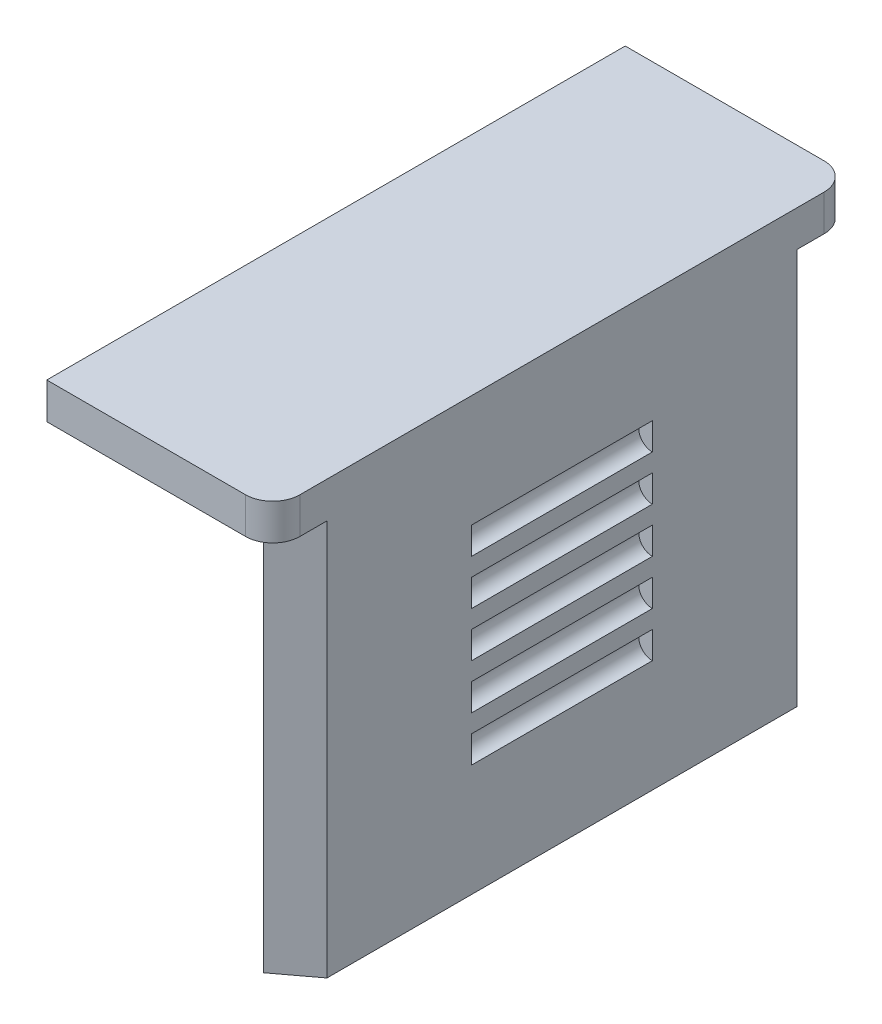
ISO-10303-21;
HEADER;
FILE_DESCRIPTION(('STEP AP214'),'2;1');
FILE_NAME('part.step','',(''),(''),'','','');
FILE_SCHEMA(('AUTOMOTIVE_DESIGN { 1 0 10303 214 1 1 1 1 }'));
ENDSEC;
DATA;
#1=APPLICATION_CONTEXT('core data for automotive mechanical design processes');
#2=APPLICATION_PROTOCOL_DEFINITION('international standard','automotive_design',2000,#1);
#3=PRODUCT_CONTEXT('',#1,'mechanical');
#4=PRODUCT('Part','Part','',(#3));
#5=PRODUCT_RELATED_PRODUCT_CATEGORY('part','',(#4));
#6=PRODUCT_DEFINITION_FORMATION('','',#4);
#7=PRODUCT_DEFINITION_CONTEXT('part definition',#1,'design');
#8=PRODUCT_DEFINITION('design','',#6,#7);
#9=PRODUCT_DEFINITION_SHAPE('','',#8);
#10=(LENGTH_UNIT() NAMED_UNIT(*) SI_UNIT(.MILLI.,.METRE.));
#11=(NAMED_UNIT(*) PLANE_ANGLE_UNIT() SI_UNIT($,.RADIAN.));
#12=(NAMED_UNIT(*) SI_UNIT($,.STERADIAN.) SOLID_ANGLE_UNIT());
#13=UNCERTAINTY_MEASURE_WITH_UNIT(LENGTH_MEASURE(1.E-05),#10,'distance_accuracy_value','');
#14=(GEOMETRIC_REPRESENTATION_CONTEXT(3) GLOBAL_UNCERTAINTY_ASSIGNED_CONTEXT((#13)) GLOBAL_UNIT_ASSIGNED_CONTEXT((#10,
#11,#12)) REPRESENTATION_CONTEXT('',''));
#15=CARTESIAN_POINT('',(0.,0.,0.));
#16=DIRECTION('',(0.,0.,1.));
#17=DIRECTION('',(1.,0.,0.));
#18=AXIS2_PLACEMENT_3D('',#15,#16,#17);
#19=CARTESIAN_POINT('',(-3.45222941321836,109.467949424705,104.41839123638));
#20=DIRECTION('',(1.,0.,0.));
#21=DIRECTION('',(0.,0.,-1.));
#22=AXIS2_PLACEMENT_3D('',#19,#20,#21);
#23=PLANE('',#22);
#24=DIRECTION('',(0.,0.,1.));
#25=VECTOR('',#24,1.);
#26=CARTESIAN_POINT('',(-3.45222941321836,97.767949424705,83.4183912363796));
#27=LINE('',#26,#25);
#28=CARTESIAN_POINT('',(-3.45222941321836,97.767949424705,83.4183912363796));
#29=VERTEX_POINT('',#28);
#30=CARTESIAN_POINT('',(-3.45222941321836,97.767949424705,93.4183912363796));
#31=VERTEX_POINT('',#30);
#32=EDGE_CURVE('E507',#29,#31,#27,.T.);
#33=ORIENTED_EDGE('',*,*,#32,.F.);
#34=DIRECTION('',(0.,-1.,0.));
#35=VECTOR('',#34,1.);
#36=CARTESIAN_POINT('',(-3.45222941321836,109.467949424705,83.4183912363796));
#37=LINE('',#36,#35);
#38=CARTESIAN_POINT('',(-3.45222941321836,96.267949424705,83.4183912363796));
#39=VERTEX_POINT('',#38);
#40=EDGE_CURVE('E205',#29,#39,#37,.T.);
#41=ORIENTED_EDGE('',*,*,#40,.T.);
#42=DIRECTION('',(0.,0.,1.));
#43=VECTOR('',#42,1.);
#44=CARTESIAN_POINT('',(-3.45222941321836,96.267949424705,83.4183912363796));
#45=LINE('',#44,#43);
#46=CARTESIAN_POINT('',(-3.45222941321836,96.267949424705,93.4183912363796));
#47=VERTEX_POINT('',#46);
#48=EDGE_CURVE('E506',#47,#39,#45,.F.);
#49=ORIENTED_EDGE('',*,*,#48,.F.);
#50=DIRECTION('',(0.,-1.,0.));
#51=VECTOR('',#50,1.);
#52=CARTESIAN_POINT('',(-3.45222941321836,109.467949424705,93.4183912363796));
#53=LINE('',#52,#51);
#54=EDGE_CURVE('E511',#31,#47,#53,.T.);
#55=ORIENTED_EDGE('',*,*,#54,.F.);
#56=EDGE_LOOP('',(#33,#41,#49,#55));
#57=FACE_BOUND('',#56,.T.);
#58=DIRECTION('',(0.,0.,1.));
#59=VECTOR('',#58,1.);
#60=CARTESIAN_POINT('',(-3.45222941321836,102.767949424705,83.4183912363796));
#61=LINE('',#60,#59);
#62=CARTESIAN_POINT('',(-3.45222941321836,102.767949424705,83.4183912363796));
#63=VERTEX_POINT('',#62);
#64=CARTESIAN_POINT('',(-3.45222941321836,102.767949424705,93.4183912363796));
#65=VERTEX_POINT('',#64);
#66=EDGE_CURVE('E526',#63,#65,#61,.T.);
#67=ORIENTED_EDGE('',*,*,#66,.F.);
#68=DIRECTION('',(0.,-1.,0.));
#69=VECTOR('',#68,1.);
#70=CARTESIAN_POINT('',(-3.45222941321836,109.467949424705,83.4183912363796));
#71=LINE('',#70,#69);
#72=CARTESIAN_POINT('',(-3.45222941321836,101.267949424705,83.4183912363796));
#73=VERTEX_POINT('',#72);
#74=EDGE_CURVE('E523',#63,#73,#71,.T.);
#75=ORIENTED_EDGE('',*,*,#74,.T.);
#76=DIRECTION('',(0.,0.,1.));
#77=VECTOR('',#76,1.);
#78=CARTESIAN_POINT('',(-3.45222941321836,101.267949424705,83.4183912363796));
#79=LINE('',#78,#77);
#80=CARTESIAN_POINT('',(-3.45222941321836,101.267949424705,93.4183912363796));
#81=VERTEX_POINT('',#80);
#82=EDGE_CURVE('E529',#81,#73,#79,.F.);
#83=ORIENTED_EDGE('',*,*,#82,.F.);
#84=DIRECTION('',(0.,-1.,0.));
#85=VECTOR('',#84,1.);
#86=CARTESIAN_POINT('',(-3.45222941321836,109.467949424705,93.4183912363796));
#87=LINE('',#86,#85);
#88=EDGE_CURVE('E531',#65,#81,#87,.T.);
#89=ORIENTED_EDGE('',*,*,#88,.F.);
#90=EDGE_LOOP('',(#67,#75,#83,#89));
#91=FACE_BOUND('',#90,.T.);
#92=DIRECTION('',(0.,0.,-1.));
#93=VECTOR('',#92,1.);
#94=CARTESIAN_POINT('',(-3.45222941321836,109.467949424705,104.41839123638));
#95=LINE('',#94,#93);
#96=CARTESIAN_POINT('',(-3.45222941321836,109.467949424705,75.4183912363796));
#97=VERTEX_POINT('',#96);
#98=CARTESIAN_POINT('',(-3.45222941321836,109.467949424705,73.9183912363796));
#99=VERTEX_POINT('',#98);
#100=EDGE_CURVE('E226',#97,#99,#95,.T.);
#101=ORIENTED_EDGE('',*,*,#100,.T.);
#102=DIRECTION('',(0.,1.,0.));
#103=VECTOR('',#102,1.);
#104=CARTESIAN_POINT('',(-3.45222941321836,109.467949424705,73.9183912363796));
#105=LINE('',#104,#103);
#106=CARTESIAN_POINT('',(-3.45222941321836,111.467949424705,73.9183912363796));
#107=VERTEX_POINT('',#106);
#108=EDGE_CURVE('E373',#99,#107,#105,.T.);
#109=ORIENTED_EDGE('',*,*,#108,.T.);
#110=DIRECTION('',(0.,0.,-1.));
#111=VECTOR('',#110,1.);
#112=CARTESIAN_POINT('',(-3.45222941321836,111.467949424705,104.41839123638));
#113=LINE('',#112,#111);
#114=CARTESIAN_POINT('',(-3.45222941321836,111.467949424705,102.91839123638));
#115=VERTEX_POINT('',#114);
#116=EDGE_CURVE('E252',#115,#107,#113,.T.);
#117=ORIENTED_EDGE('',*,*,#116,.F.);
#118=DIRECTION('',(0.,1.,0.));
#119=VECTOR('',#118,1.);
#120=CARTESIAN_POINT('',(-3.45222941321836,109.467949424705,102.91839123638));
#121=LINE('',#120,#119);
#122=CARTESIAN_POINT('',(-3.45222941321836,109.467949424705,102.91839123638));
#123=VERTEX_POINT('',#122);
#124=EDGE_CURVE('E221',#115,#123,#121,.F.);
#125=ORIENTED_EDGE('',*,*,#124,.T.);
#126=CARTESIAN_POINT('',(-3.45222941321836,109.467949424705,101.41839123638));
#127=VERTEX_POINT('',#126);
#128=EDGE_CURVE('E222',#123,#127,#95,.T.);
#129=ORIENTED_EDGE('',*,*,#128,.T.);
#130=DIRECTION('',(0.,1.,0.));
#131=VECTOR('',#130,1.);
#132=CARTESIAN_POINT('',(-3.45222941321836,87.567949424705,101.41839123638));
#133=LINE('',#132,#131);
#134=CARTESIAN_POINT('',(-3.45222941321836,87.567949424705,101.41839123638));
#135=VERTEX_POINT('',#134);
#136=EDGE_CURVE('E249',#135,#127,#133,.T.);
#137=ORIENTED_EDGE('',*,*,#136,.F.);
#138=DIRECTION('',(0.,0.,1.));
#139=VECTOR('',#138,1.);
#140=CARTESIAN_POINT('',(-3.45222941321836,87.567949424705,75.4183912363796));
#141=LINE('',#140,#139);
#142=CARTESIAN_POINT('',(-3.45222941321836,87.567949424705,75.4183912363796));
#143=VERTEX_POINT('',#142);
#144=EDGE_CURVE('E259',#143,#135,#141,.T.);
#145=ORIENTED_EDGE('',*,*,#144,.F.);
#146=DIRECTION('',(0.,1.,0.));
#147=VECTOR('',#146,1.);
#148=CARTESIAN_POINT('',(-3.45222941321836,87.567949424705,75.4183912363796));
#149=LINE('',#148,#147);
#150=EDGE_CURVE('E261',#143,#97,#149,.T.);
#151=ORIENTED_EDGE('',*,*,#150,.T.);
#152=EDGE_LOOP('',(#101,#109,#117,#125,#129,#137,#145,#151));
#153=FACE_BOUND('',#152,.T.);
#154=DIRECTION('',(0.,0.,1.));
#155=VECTOR('',#154,1.);
#156=CARTESIAN_POINT('',(-3.45222941321836,105.267949424705,83.4183912363796));
#157=LINE('',#156,#155);
#158=CARTESIAN_POINT('',(-3.45222941321836,105.267949424705,83.4183912363796));
#159=VERTEX_POINT('',#158);
#160=CARTESIAN_POINT('',(-3.45222941321836,105.267949424705,93.4183912363796));
#161=VERTEX_POINT('',#160);
#162=EDGE_CURVE('E536',#159,#161,#157,.T.);
#163=ORIENTED_EDGE('',*,*,#162,.F.);
#164=DIRECTION('',(0.,-1.,0.));
#165=VECTOR('',#164,1.);
#166=CARTESIAN_POINT('',(-3.45222941321836,109.467949424705,83.4183912363796));
#167=LINE('',#166,#165);
#168=CARTESIAN_POINT('',(-3.45222941321836,103.767949424705,83.4183912363796));
#169=VERTEX_POINT('',#168);
#170=EDGE_CURVE('E533',#159,#169,#167,.T.);
#171=ORIENTED_EDGE('',*,*,#170,.T.);
#172=DIRECTION('',(0.,0.,1.));
#173=VECTOR('',#172,1.);
#174=CARTESIAN_POINT('',(-3.45222941321836,103.767949424705,83.4183912363796));
#175=LINE('',#174,#173);
#176=CARTESIAN_POINT('',(-3.45222941321836,103.767949424705,93.4183912363796));
#177=VERTEX_POINT('',#176);
#178=EDGE_CURVE('E405',#177,#169,#175,.F.);
#179=ORIENTED_EDGE('',*,*,#178,.F.);
#180=DIRECTION('',(0.,-1.,0.));
#181=VECTOR('',#180,1.);
#182=CARTESIAN_POINT('',(-3.45222941321836,109.467949424705,93.4183912363796));
#183=LINE('',#182,#181);
#184=EDGE_CURVE('E402',#161,#177,#183,.T.);
#185=ORIENTED_EDGE('',*,*,#184,.F.);
#186=EDGE_LOOP('',(#163,#171,#179,#185));
#187=FACE_BOUND('',#186,.T.);
#188=DIRECTION('',(0.,0.,1.));
#189=VECTOR('',#188,1.);
#190=CARTESIAN_POINT('',(-3.45222941321836,100.267949424705,83.4183912363796));
#191=LINE('',#190,#189);
#192=CARTESIAN_POINT('',(-3.45222941321836,100.267949424705,83.4183912363796));
#193=VERTEX_POINT('',#192);
#194=CARTESIAN_POINT('',(-3.45222941321836,100.267949424705,93.4183912363796));
#195=VERTEX_POINT('',#194);
#196=EDGE_CURVE('E516',#193,#195,#191,.T.);
#197=ORIENTED_EDGE('',*,*,#196,.F.);
#198=DIRECTION('',(0.,-1.,0.));
#199=VECTOR('',#198,1.);
#200=CARTESIAN_POINT('',(-3.45222941321836,109.467949424705,83.4183912363796));
#201=LINE('',#200,#199);
#202=CARTESIAN_POINT('',(-3.45222941321836,98.767949424705,83.4183912363796));
#203=VERTEX_POINT('',#202);
#204=EDGE_CURVE('E513',#193,#203,#201,.T.);
#205=ORIENTED_EDGE('',*,*,#204,.T.);
#206=DIRECTION('',(0.,0.,1.));
#207=VECTOR('',#206,1.);
#208=CARTESIAN_POINT('',(-3.45222941321836,98.767949424705,83.4183912363796));
#209=LINE('',#208,#207);
#210=CARTESIAN_POINT('',(-3.45222941321836,98.767949424705,93.4183912363796));
#211=VERTEX_POINT('',#210);
#212=EDGE_CURVE('E519',#211,#203,#209,.F.);
#213=ORIENTED_EDGE('',*,*,#212,.F.);
#214=DIRECTION('',(0.,-1.,0.));
#215=VECTOR('',#214,1.);
#216=CARTESIAN_POINT('',(-3.45222941321836,109.467949424705,93.4183912363796));
#217=LINE('',#216,#215);
#218=EDGE_CURVE('E521',#195,#211,#217,.T.);
#219=ORIENTED_EDGE('',*,*,#218,.F.);
#220=EDGE_LOOP('',(#197,#205,#213,#219));
#221=FACE_BOUND('',#220,.T.);
#222=DIRECTION('',(0.,0.,1.));
#223=VECTOR('',#222,1.);
#224=CARTESIAN_POINT('',(-3.45222941321836,95.267949424705,83.4183912363796));
#225=LINE('',#224,#223);
#226=CARTESIAN_POINT('',(-3.45222941321836,95.267949424705,83.4183912363796));
#227=VERTEX_POINT('',#226);
#228=CARTESIAN_POINT('',(-3.45222941321836,95.267949424705,93.4183912363796));
#229=VERTEX_POINT('',#228);
#230=EDGE_CURVE('E211',#227,#229,#225,.T.);
#231=ORIENTED_EDGE('',*,*,#230,.F.);
#232=DIRECTION('',(0.,-1.,0.));
#233=VECTOR('',#232,1.);
#234=CARTESIAN_POINT('',(-3.45222941321836,109.467949424705,83.4183912363796));
#235=LINE('',#234,#233);
#236=CARTESIAN_POINT('',(-3.45222941321836,93.767949424705,83.4183912363796));
#237=VERTEX_POINT('',#236);
#238=EDGE_CURVE('E215',#227,#237,#235,.T.);
#239=ORIENTED_EDGE('',*,*,#238,.T.);
#240=DIRECTION('',(0.,0.,1.));
#241=VECTOR('',#240,1.);
#242=CARTESIAN_POINT('',(-3.45222941321836,93.767949424705,83.4183912363796));
#243=LINE('',#242,#241);
#244=CARTESIAN_POINT('',(-3.45222941321836,93.767949424705,93.4183912363796));
#245=VERTEX_POINT('',#244);
#246=EDGE_CURVE('E204',#245,#237,#243,.F.);
#247=ORIENTED_EDGE('',*,*,#246,.F.);
#248=DIRECTION('',(0.,-1.,0.));
#249=VECTOR('',#248,1.);
#250=CARTESIAN_POINT('',(-3.45222941321836,109.467949424705,93.4183912363796));
#251=LINE('',#250,#249);
#252=EDGE_CURVE('E196',#229,#245,#251,.T.);
#253=ORIENTED_EDGE('',*,*,#252,.F.);
#254=EDGE_LOOP('',(#231,#239,#247,#253));
#255=FACE_BOUND('',#254,.T.);
#256=ADVANCED_FACE('F33',(#57,#91,#153,#187,#221,#255),#23,.T.);
#257=CARTESIAN_POINT('',(0.,109.467949424705,0.));
#258=DIRECTION('',(0.,1.,0.));
#259=DIRECTION('',(0.,0.,1.));
#260=AXIS2_PLACEMENT_3D('',#257,#258,#259);
#261=PLANE('',#260);
#262=DIRECTION('',(-1.,0.,0.));
#263=VECTOR('',#262,1.);
#264=CARTESIAN_POINT('',(-3.45222941321836,109.467949424705,72.4183912363796));
#265=LINE('',#264,#263);
#266=CARTESIAN_POINT('',(-4.95222941321836,109.467949424705,72.4183912363796));
#267=VERTEX_POINT('',#266);
#268=CARTESIAN_POINT('',(-15.9522294132184,109.467949424705,72.4183912363796));
#269=VERTEX_POINT('',#268);
#270=EDGE_CURVE('E225',#267,#269,#265,.T.);
#271=ORIENTED_EDGE('',*,*,#270,.F.);
#272=CARTESIAN_POINT('',(-4.95222941321836,109.467949424705,73.9183912363796));
#273=DIRECTION('',(0.,1.,0.));
#274=DIRECTION('',(0.,0.,1.));
#275=AXIS2_PLACEMENT_3D('',#272,#273,#274);
#276=CIRCLE('',#275,1.5);
#277=EDGE_CURVE('E41',#267,#99,#276,.F.);
#278=ORIENTED_EDGE('',*,*,#277,.T.);
#279=ORIENTED_EDGE('',*,*,#100,.F.);
#280=DIRECTION('',(0.799999999999999,0.,0.600000000000001));
#281=VECTOR('',#280,1.);
#282=CARTESIAN_POINT('',(-3.45222941321836,109.467949424705,75.4183912363796));
#283=LINE('',#282,#281);
#284=CARTESIAN_POINT('',(-5.45222941321836,109.467949424705,73.9183912363796));
#285=VERTEX_POINT('',#284);
#286=EDGE_CURVE('E255',#285,#97,#283,.T.);
#287=ORIENTED_EDGE('',*,*,#286,.F.);
#288=DIRECTION('',(0.,0.,-1.));
#289=VECTOR('',#288,1.);
#290=CARTESIAN_POINT('',(-5.45222941321836,109.467949424705,102.91839123638));
#291=LINE('',#290,#289);
#292=CARTESIAN_POINT('',(-5.45222941321836,109.467949424705,80.9183912363796));
#293=VERTEX_POINT('',#292);
#294=EDGE_CURVE('E245',#293,#285,#291,.T.);
#295=ORIENTED_EDGE('',*,*,#294,.F.);
#296=DIRECTION('',(1.,0.,0.));
#297=VECTOR('',#296,1.);
#298=CARTESIAN_POINT('',(-5.45222941321835,109.467949424705,80.9183912363796));
#299=LINE('',#298,#297);
#300=CARTESIAN_POINT('',(-6.45222941321835,109.467949424705,80.9183912363796));
#301=VERTEX_POINT('',#300);
#302=EDGE_CURVE('E296',#301,#293,#299,.T.);
#303=ORIENTED_EDGE('',*,*,#302,.F.);
#304=DIRECTION('',(0.,0.,-1.));
#305=VECTOR('',#304,1.);
#306=CARTESIAN_POINT('',(-6.45222941321835,109.467949424705,95.9183912363796));
#307=LINE('',#306,#305);
#308=CARTESIAN_POINT('',(-6.45222941321835,109.467949424705,95.9183912363796));
#309=VERTEX_POINT('',#308);
#310=EDGE_CURVE('E300',#309,#301,#307,.T.);
#311=ORIENTED_EDGE('',*,*,#310,.F.);
#312=DIRECTION('',(-1.,0.,0.));
#313=VECTOR('',#312,1.);
#314=CARTESIAN_POINT('',(-5.45222941321835,109.467949424705,95.9183912363796));
#315=LINE('',#314,#313);
#316=CARTESIAN_POINT('',(-5.45222941321836,109.467949424705,95.9183912363796));
#317=VERTEX_POINT('',#316);
#318=EDGE_CURVE('E303',#317,#309,#315,.T.);
#319=ORIENTED_EDGE('',*,*,#318,.F.);
#320=CARTESIAN_POINT('',(-5.45222941321836,109.467949424705,102.91839123638));
#321=VERTEX_POINT('',#320);
#322=EDGE_CURVE('E260',#321,#317,#291,.T.);
#323=ORIENTED_EDGE('',*,*,#322,.F.);
#324=DIRECTION('',(-0.799999999999999,0.,0.600000000000001));
#325=VECTOR('',#324,1.);
#326=CARTESIAN_POINT('',(-3.45222941321836,109.467949424705,101.41839123638));
#327=LINE('',#326,#325);
#328=EDGE_CURVE('E242',#127,#321,#327,.T.);
#329=ORIENTED_EDGE('',*,*,#328,.F.);
#330=ORIENTED_EDGE('',*,*,#128,.F.);
#331=CARTESIAN_POINT('',(-4.95222941321836,109.467949424705,102.91839123638));
#332=DIRECTION('',(0.,1.,0.));
#333=DIRECTION('',(0.,0.,1.));
#334=AXIS2_PLACEMENT_3D('',#331,#332,#333);
#335=CIRCLE('',#334,1.5);
#336=CARTESIAN_POINT('',(-4.95222941321836,109.467949424705,104.41839123638));
#337=VERTEX_POINT('',#336);
#338=EDGE_CURVE('E48',#123,#337,#335,.F.);
#339=ORIENTED_EDGE('',*,*,#338,.T.);
#340=DIRECTION('',(1.,0.,0.));
#341=VECTOR('',#340,1.);
#342=CARTESIAN_POINT('',(-15.9522294132184,109.467949424705,104.41839123638));
#343=LINE('',#342,#341);
#344=CARTESIAN_POINT('',(-15.9522294132184,109.467949424705,104.41839123638));
#345=VERTEX_POINT('',#344);
#346=EDGE_CURVE('E391',#345,#337,#343,.T.);
#347=ORIENTED_EDGE('',*,*,#346,.F.);
#348=DIRECTION('',(0.,0.,1.));
#349=VECTOR('',#348,1.);
#350=CARTESIAN_POINT('',(-15.9522294132184,109.467949424705,72.4183912363796));
#351=LINE('',#350,#349);
#352=EDGE_CURVE('E409',#269,#345,#351,.T.);
#353=ORIENTED_EDGE('',*,*,#352,.F.);
#354=EDGE_LOOP('',(#271,#278,#279,#287,#295,#303,#311,#319,#323,#329,#330,#339,#347,#353));
#355=FACE_BOUND('',#354,.T.);
#356=ADVANCED_FACE('F351',(#355),#261,.F.);
#357=CARTESIAN_POINT('',(-5.45222941321836,87.567949424705,102.91839123638));
#358=DIRECTION('',(1.,0.,0.));
#359=DIRECTION('',(0.,0.,-1.));
#360=AXIS2_PLACEMENT_3D('',#357,#358,#359);
#361=PLANE('',#360);
#362=DIRECTION('',(0.,1.,0.));
#363=VECTOR('',#362,1.);
#364=CARTESIAN_POINT('',(-5.45222941321835,89.467949424705,95.9183912363796));
#365=LINE('',#364,#363);
#366=CARTESIAN_POINT('',(-5.45222941321835,89.467949424705,95.9183912363796));
#367=VERTEX_POINT('',#366);
#368=EDGE_CURVE('E246',#367,#317,#365,.T.);
#369=ORIENTED_EDGE('',*,*,#368,.F.);
#370=DIRECTION('',(0.,0.,1.));
#371=VECTOR('',#370,1.);
#372=CARTESIAN_POINT('',(-5.45222941321835,89.467949424705,95.9183912363796));
#373=LINE('',#372,#371);
#374=CARTESIAN_POINT('',(-5.45222941321836,89.467949424705,80.9183912363796));
#375=VERTEX_POINT('',#374);
#376=EDGE_CURVE('E299',#375,#367,#373,.T.);
#377=ORIENTED_EDGE('',*,*,#376,.F.);
#378=DIRECTION('',(0.,1.,0.));
#379=VECTOR('',#378,1.);
#380=CARTESIAN_POINT('',(-5.45222941321835,89.467949424705,80.9183912363796));
#381=LINE('',#380,#379);
#382=EDGE_CURVE('E293',#375,#293,#381,.T.);
#383=ORIENTED_EDGE('',*,*,#382,.T.);
#384=ORIENTED_EDGE('',*,*,#294,.T.);
#385=DIRECTION('',(0.,1.,0.));
#386=VECTOR('',#385,1.);
#387=CARTESIAN_POINT('',(-5.45222941321836,87.567949424705,73.9183912363796));
#388=LINE('',#387,#386);
#389=CARTESIAN_POINT('',(-5.45222941321836,87.567949424705,73.9183912363796));
#390=VERTEX_POINT('',#389);
#391=EDGE_CURVE('E266',#390,#285,#388,.T.);
#392=ORIENTED_EDGE('',*,*,#391,.F.);
#393=DIRECTION('',(0.,0.,-1.));
#394=VECTOR('',#393,1.);
#395=CARTESIAN_POINT('',(-5.45222941321836,87.567949424705,102.91839123638));
#396=LINE('',#395,#394);
#397=CARTESIAN_POINT('',(-5.45222941321836,87.567949424705,102.91839123638));
#398=VERTEX_POINT('',#397);
#399=EDGE_CURVE('E277',#398,#390,#396,.T.);
#400=ORIENTED_EDGE('',*,*,#399,.F.);
#401=DIRECTION('',(0.,1.,0.));
#402=VECTOR('',#401,1.);
#403=CARTESIAN_POINT('',(-5.45222941321836,87.567949424705,102.91839123638));
#404=LINE('',#403,#402);
#405=EDGE_CURVE('E231',#398,#321,#404,.T.);
#406=ORIENTED_EDGE('',*,*,#405,.T.);
#407=ORIENTED_EDGE('',*,*,#322,.T.);
#408=EDGE_LOOP('',(#369,#377,#383,#384,#392,#400,#406,#407));
#409=FACE_BOUND('',#408,.T.);
#410=ADVANCED_FACE('F357',(#409),#361,.F.);
#411=CARTESIAN_POINT('',(-15.9522294132184,109.467949424705,104.41839123638));
#412=DIRECTION('',(0.,0.,1.));
#413=DIRECTION('',(1.,0.,0.));
#414=AXIS2_PLACEMENT_3D('',#411,#412,#413);
#415=PLANE('',#414);
#416=ORIENTED_EDGE('',*,*,#346,.T.);
#417=DIRECTION('',(0.,1.,0.));
#418=VECTOR('',#417,1.);
#419=CARTESIAN_POINT('',(-4.95222941321836,109.467949424705,104.41839123638));
#420=LINE('',#419,#418);
#421=CARTESIAN_POINT('',(-4.95222941321836,111.467949424705,104.41839123638));
#422=VERTEX_POINT('',#421);
#423=EDGE_CURVE('E11',#337,#422,#420,.T.);
#424=ORIENTED_EDGE('',*,*,#423,.T.);
#425=DIRECTION('',(1.,0.,0.));
#426=VECTOR('',#425,1.);
#427=CARTESIAN_POINT('',(-15.9522294132184,111.467949424705,104.41839123638));
#428=LINE('',#427,#426);
#429=CARTESIAN_POINT('',(-15.9522294132184,111.467949424705,104.41839123638));
#430=VERTEX_POINT('',#429);
#431=EDGE_CURVE('E239',#430,#422,#428,.T.);
#432=ORIENTED_EDGE('',*,*,#431,.F.);
#433=DIRECTION('',(0.,1.,0.));
#434=VECTOR('',#433,1.);
#435=CARTESIAN_POINT('',(-15.9522294132184,109.467949424705,104.41839123638));
#436=LINE('',#435,#434);
#437=EDGE_CURVE('E401',#345,#430,#436,.T.);
#438=ORIENTED_EDGE('',*,*,#437,.F.);
#439=EDGE_LOOP('',(#416,#424,#432,#438));
#440=FACE_BOUND('',#439,.T.);
#441=ADVANCED_FACE('F390',(#440),#415,.T.);
#442=CARTESIAN_POINT('',(-15.9522294132184,109.467949424705,72.4183912363796));
#443=DIRECTION('',(-1.,0.,0.));
#444=DIRECTION('',(0.,0.,1.));
#445=AXIS2_PLACEMENT_3D('',#442,#443,#444);
#446=PLANE('',#445);
#447=DIRECTION('',(0.,0.,1.));
#448=VECTOR('',#447,1.);
#449=CARTESIAN_POINT('',(-15.9522294132184,111.467949424705,72.4183912363796));
#450=LINE('',#449,#448);
#451=CARTESIAN_POINT('',(-15.9522294132184,111.467949424705,72.4183912363796));
#452=VERTEX_POINT('',#451);
#453=EDGE_CURVE('E396',#452,#430,#450,.T.);
#454=ORIENTED_EDGE('',*,*,#453,.F.);
#455=DIRECTION('',(0.,1.,0.));
#456=VECTOR('',#455,1.);
#457=CARTESIAN_POINT('',(-15.9522294132184,109.467949424705,72.4183912363796));
#458=LINE('',#457,#456);
#459=EDGE_CURVE('E240',#269,#452,#458,.T.);
#460=ORIENTED_EDGE('',*,*,#459,.F.);
#461=ORIENTED_EDGE('',*,*,#352,.T.);
#462=ORIENTED_EDGE('',*,*,#437,.T.);
#463=EDGE_LOOP('',(#454,#460,#461,#462));
#464=FACE_BOUND('',#463,.T.);
#465=ADVANCED_FACE('F413',(#464),#446,.T.);
#466=CARTESIAN_POINT('',(-3.45222941321836,109.467949424705,72.4183912363796));
#467=DIRECTION('',(0.,0.,-1.));
#468=DIRECTION('',(-1.,0.,0.));
#469=AXIS2_PLACEMENT_3D('',#466,#467,#468);
#470=PLANE('',#469);
#471=DIRECTION('',(-1.,0.,0.));
#472=VECTOR('',#471,1.);
#473=CARTESIAN_POINT('',(-3.45222941321836,111.467949424705,72.4183912363796));
#474=LINE('',#473,#472);
#475=CARTESIAN_POINT('',(-4.95222941321836,111.467949424705,72.4183912363796));
#476=VERTEX_POINT('',#475);
#477=EDGE_CURVE('E398',#476,#452,#474,.T.);
#478=ORIENTED_EDGE('',*,*,#477,.F.);
#479=DIRECTION('',(0.,1.,0.));
#480=VECTOR('',#479,1.);
#481=CARTESIAN_POINT('',(-4.95222941321836,109.467949424705,72.4183912363796));
#482=LINE('',#481,#480);
#483=EDGE_CURVE('E56',#476,#267,#482,.F.);
#484=ORIENTED_EDGE('',*,*,#483,.T.);
#485=ORIENTED_EDGE('',*,*,#270,.T.);
#486=ORIENTED_EDGE('',*,*,#459,.T.);
#487=EDGE_LOOP('',(#478,#484,#485,#486));
#488=FACE_BOUND('',#487,.T.);
#489=ADVANCED_FACE('F362',(#488),#470,.T.);
#490=CARTESIAN_POINT('',(0.,111.467949424705,0.));
#491=DIRECTION('',(0.,1.,0.));
#492=DIRECTION('',(0.,0.,1.));
#493=AXIS2_PLACEMENT_3D('',#490,#491,#492);
#494=PLANE('',#493);
#495=ORIENTED_EDGE('',*,*,#116,.T.);
#496=CARTESIAN_POINT('',(-4.95222941321836,111.467949424705,73.9183912363796));
#497=DIRECTION('',(0.,1.,0.));
#498=DIRECTION('',(0.,0.,1.));
#499=AXIS2_PLACEMENT_3D('',#496,#497,#498);
#500=CIRCLE('',#499,1.5);
#501=EDGE_CURVE('E377',#107,#476,#500,.T.);
#502=ORIENTED_EDGE('',*,*,#501,.T.);
#503=ORIENTED_EDGE('',*,*,#477,.T.);
#504=ORIENTED_EDGE('',*,*,#453,.T.);
#505=ORIENTED_EDGE('',*,*,#431,.T.);
#506=CARTESIAN_POINT('',(-4.95222941321836,111.467949424705,102.91839123638));
#507=DIRECTION('',(0.,1.,0.));
#508=DIRECTION('',(0.,0.,1.));
#509=AXIS2_PLACEMENT_3D('',#506,#507,#508);
#510=CIRCLE('',#509,1.5);
#511=EDGE_CURVE('E379',#422,#115,#510,.T.);
#512=ORIENTED_EDGE('',*,*,#511,.T.);
#513=EDGE_LOOP('',(#495,#502,#503,#504,#505,#512));
#514=FACE_BOUND('',#513,.T.);
#515=ADVANCED_FACE('F394',(#514),#494,.T.);
#516=CARTESIAN_POINT('',(-3.45222941321836,87.567949424705,101.41839123638));
#517=DIRECTION('',(-0.600000000000001,0.,-0.799999999999999));
#518=DIRECTION('',(-0.799999999999999,0.,0.600000000000001));
#519=AXIS2_PLACEMENT_3D('',#516,#517,#518);
#520=PLANE('',#519);
#521=ORIENTED_EDGE('',*,*,#328,.T.);
#522=ORIENTED_EDGE('',*,*,#405,.F.);
#523=DIRECTION('',(-0.799999999999999,0.,0.600000000000001));
#524=VECTOR('',#523,1.);
#525=CARTESIAN_POINT('',(-3.45222941321836,87.567949424705,101.41839123638));
#526=LINE('',#525,#524);
#527=EDGE_CURVE('E280',#135,#398,#526,.T.);
#528=ORIENTED_EDGE('',*,*,#527,.F.);
#529=ORIENTED_EDGE('',*,*,#136,.T.);
#530=EDGE_LOOP('',(#521,#522,#528,#529));
#531=FACE_BOUND('',#530,.T.);
#532=ADVANCED_FACE('F418',(#531),#520,.F.);
#533=CARTESIAN_POINT('',(-3.45222941321836,87.567949424705,75.4183912363796));
#534=DIRECTION('',(-0.600000000000001,0.,0.799999999999999));
#535=DIRECTION('',(0.799999999999999,0.,0.600000000000001));
#536=AXIS2_PLACEMENT_3D('',#533,#534,#535);
#537=PLANE('',#536);
#538=ORIENTED_EDGE('',*,*,#286,.T.);
#539=ORIENTED_EDGE('',*,*,#150,.F.);
#540=DIRECTION('',(0.799999999999999,0.,0.600000000000001));
#541=VECTOR('',#540,1.);
#542=CARTESIAN_POINT('',(-3.45222941321836,87.567949424705,75.4183912363796));
#543=LINE('',#542,#541);
#544=EDGE_CURVE('E273',#390,#143,#543,.T.);
#545=ORIENTED_EDGE('',*,*,#544,.F.);
#546=ORIENTED_EDGE('',*,*,#391,.T.);
#547=EDGE_LOOP('',(#538,#539,#545,#546));
#548=FACE_BOUND('',#547,.T.);
#549=ADVANCED_FACE('F427',(#548),#537,.F.);
#550=CARTESIAN_POINT('',(0.,87.567949424705,0.));
#551=DIRECTION('',(0.,-1.,0.));
#552=DIRECTION('',(0.,0.,-1.));
#553=AXIS2_PLACEMENT_3D('',#550,#551,#552);
#554=PLANE('',#553);
#555=ORIENTED_EDGE('',*,*,#144,.T.);
#556=ORIENTED_EDGE('',*,*,#527,.T.);
#557=ORIENTED_EDGE('',*,*,#399,.T.);
#558=ORIENTED_EDGE('',*,*,#544,.T.);
#559=EDGE_LOOP('',(#555,#556,#557,#558));
#560=FACE_BOUND('',#559,.T.);
#561=ADVANCED_FACE('F434',(#560),#554,.T.);
#562=CARTESIAN_POINT('',(-5.45222941321835,89.467949424705,95.9183912363796));
#563=DIRECTION('',(0.,0.,-1.));
#564=DIRECTION('',(-1.,0.,0.));
#565=AXIS2_PLACEMENT_3D('',#562,#563,#564);
#566=PLANE('',#565);
#567=ORIENTED_EDGE('',*,*,#318,.T.);
#568=DIRECTION('',(0.,1.,0.));
#569=VECTOR('',#568,1.);
#570=CARTESIAN_POINT('',(-6.45222941321835,89.467949424705,95.9183912363796));
#571=LINE('',#570,#569);
#572=CARTESIAN_POINT('',(-6.45222941321835,89.467949424705,95.9183912363796));
#573=VERTEX_POINT('',#572);
#574=EDGE_CURVE('E287',#573,#309,#571,.T.);
#575=ORIENTED_EDGE('',*,*,#574,.F.);
#576=DIRECTION('',(-1.,0.,0.));
#577=VECTOR('',#576,1.);
#578=CARTESIAN_POINT('',(-5.45222941321835,89.467949424705,95.9183912363796));
#579=LINE('',#578,#577);
#580=EDGE_CURVE('E311',#367,#573,#579,.T.);
#581=ORIENTED_EDGE('',*,*,#580,.F.);
#582=ORIENTED_EDGE('',*,*,#368,.T.);
#583=EDGE_LOOP('',(#567,#575,#581,#582));
#584=FACE_BOUND('',#583,.T.);
#585=ADVANCED_FACE('F437',(#584),#566,.F.);
#586=CARTESIAN_POINT('',(-6.45222941321835,89.467949424705,95.9183912363796));
#587=DIRECTION('',(1.,0.,0.));
#588=DIRECTION('',(0.,0.,-1.));
#589=AXIS2_PLACEMENT_3D('',#586,#587,#588);
#590=PLANE('',#589);
#591=ORIENTED_EDGE('',*,*,#310,.T.);
#592=DIRECTION('',(0.,1.,0.));
#593=VECTOR('',#592,1.);
#594=CARTESIAN_POINT('',(-6.45222941321835,89.467949424705,80.9183912363796));
#595=LINE('',#594,#593);
#596=CARTESIAN_POINT('',(-6.45222941321835,89.467949424705,80.9183912363796));
#597=VERTEX_POINT('',#596);
#598=EDGE_CURVE('E290',#597,#301,#595,.T.);
#599=ORIENTED_EDGE('',*,*,#598,.F.);
#600=DIRECTION('',(0.,0.,-1.));
#601=VECTOR('',#600,1.);
#602=CARTESIAN_POINT('',(-6.45222941321835,89.467949424705,95.9183912363796));
#603=LINE('',#602,#601);
#604=EDGE_CURVE('E309',#573,#597,#603,.T.);
#605=ORIENTED_EDGE('',*,*,#604,.F.);
#606=ORIENTED_EDGE('',*,*,#574,.T.);
#607=EDGE_LOOP('',(#591,#599,#605,#606));
#608=FACE_BOUND('',#607,.T.);
#609=ADVANCED_FACE('F440',(#608),#590,.F.);
#610=CARTESIAN_POINT('',(-5.45222941321835,89.467949424705,80.9183912363796));
#611=DIRECTION('',(0.,0.,1.));
#612=DIRECTION('',(1.,0.,0.));
#613=AXIS2_PLACEMENT_3D('',#610,#611,#612);
#614=PLANE('',#613);
#615=ORIENTED_EDGE('',*,*,#302,.T.);
#616=ORIENTED_EDGE('',*,*,#382,.F.);
#617=DIRECTION('',(1.,0.,0.));
#618=VECTOR('',#617,1.);
#619=CARTESIAN_POINT('',(-5.45222941321835,89.467949424705,80.9183912363796));
#620=LINE('',#619,#618);
#621=EDGE_CURVE('E295',#597,#375,#620,.T.);
#622=ORIENTED_EDGE('',*,*,#621,.F.);
#623=ORIENTED_EDGE('',*,*,#598,.T.);
#624=EDGE_LOOP('',(#615,#616,#622,#623));
#625=FACE_BOUND('',#624,.T.);
#626=ADVANCED_FACE('F444',(#625),#614,.F.);
#627=CARTESIAN_POINT('',(0.,89.467949424705,0.));
#628=DIRECTION('',(0.,1.,0.));
#629=DIRECTION('',(0.,0.,1.));
#630=AXIS2_PLACEMENT_3D('',#627,#628,#629);
#631=PLANE('',#630);
#632=ORIENTED_EDGE('',*,*,#376,.T.);
#633=ORIENTED_EDGE('',*,*,#580,.T.);
#634=ORIENTED_EDGE('',*,*,#604,.T.);
#635=ORIENTED_EDGE('',*,*,#621,.T.);
#636=EDGE_LOOP('',(#632,#633,#634,#635));
#637=FACE_BOUND('',#636,.T.);
#638=ADVANCED_FACE('F448',(#637),#631,.F.);
#639=CARTESIAN_POINT('',(-3.45222941321836,104.517949424705,83.4183912363796));
#640=DIRECTION('',(0.,0.,1.));
#641=DIRECTION('',(1.,0.,0.));
#642=AXIS2_PLACEMENT_3D('',#639,#640,#641);
#643=CYLINDRICAL_SURFACE('',#642,0.749999999999999);
#644=ORIENTED_EDGE('',*,*,#162,.T.);
#645=CARTESIAN_POINT('',(-3.45222941321836,104.517949424705,93.4183912363796));
#646=DIRECTION('',(0.,0.,1.));
#647=DIRECTION('',(1.,0.,0.));
#648=AXIS2_PLACEMENT_3D('',#645,#646,#647);
#649=CIRCLE('',#648,0.749999999999999);
#650=EDGE_CURVE('E315',#161,#177,#649,.T.);
#651=ORIENTED_EDGE('',*,*,#650,.T.);
#652=ORIENTED_EDGE('',*,*,#178,.T.);
#653=CARTESIAN_POINT('',(-3.45222941321836,104.517949424705,83.4183912363796));
#654=DIRECTION('',(0.,0.,1.));
#655=DIRECTION('',(1.,0.,0.));
#656=AXIS2_PLACEMENT_3D('',#653,#654,#655);
#657=CIRCLE('',#656,0.749999999999999);
#658=EDGE_CURVE('E306',#159,#169,#657,.T.);
#659=ORIENTED_EDGE('',*,*,#658,.F.);
#660=EDGE_LOOP('',(#644,#651,#652,#659));
#661=FACE_BOUND('',#660,.T.);
#662=ADVANCED_FACE('F452',(#661),#643,.F.);
#663=CARTESIAN_POINT('',(-3.45222941321836,104.517949424705,83.4183912363796));
#664=DIRECTION('',(0.,0.,1.));
#665=DIRECTION('',(1.,0.,0.));
#666=AXIS2_PLACEMENT_3D('',#663,#664,#665);
#667=PLANE('',#666);
#668=ORIENTED_EDGE('',*,*,#658,.T.);
#669=ORIENTED_EDGE('',*,*,#170,.F.);
#670=EDGE_LOOP('',(#668,#669));
#671=FACE_BOUND('',#670,.T.);
#672=ADVANCED_FACE('F456',(#671),#667,.T.);
#673=CARTESIAN_POINT('',(-3.45222941321836,104.517949424705,93.4183912363796));
#674=DIRECTION('',(0.,0.,1.));
#675=DIRECTION('',(1.,0.,0.));
#676=AXIS2_PLACEMENT_3D('',#673,#674,#675);
#677=PLANE('',#676);
#678=ORIENTED_EDGE('',*,*,#184,.T.);
#679=ORIENTED_EDGE('',*,*,#650,.F.);
#680=EDGE_LOOP('',(#678,#679));
#681=FACE_BOUND('',#680,.T.);
#682=ADVANCED_FACE('F458',(#681),#677,.F.);
#683=CARTESIAN_POINT('',(-3.45222941321836,102.017949424705,83.4183912363796));
#684=DIRECTION('',(0.,0.,1.));
#685=DIRECTION('',(1.,0.,0.));
#686=AXIS2_PLACEMENT_3D('',#683,#684,#685);
#687=CYLINDRICAL_SURFACE('',#686,0.749999999999999);
#688=ORIENTED_EDGE('',*,*,#66,.T.);
#689=CARTESIAN_POINT('',(-3.45222941321836,102.017949424705,93.4183912363796));
#690=DIRECTION('',(0.,0.,1.));
#691=DIRECTION('',(1.,0.,0.));
#692=AXIS2_PLACEMENT_3D('',#689,#690,#691);
#693=CIRCLE('',#692,0.749999999999999);
#694=EDGE_CURVE('E321',#65,#81,#693,.T.);
#695=ORIENTED_EDGE('',*,*,#694,.T.);
#696=ORIENTED_EDGE('',*,*,#82,.T.);
#697=CARTESIAN_POINT('',(-3.45222941321836,102.017949424705,83.4183912363796));
#698=DIRECTION('',(0.,0.,1.));
#699=DIRECTION('',(1.,0.,0.));
#700=AXIS2_PLACEMENT_3D('',#697,#698,#699);
#701=CIRCLE('',#700,0.749999999999999);
#702=EDGE_CURVE('E318',#63,#73,#701,.T.);
#703=ORIENTED_EDGE('',*,*,#702,.F.);
#704=EDGE_LOOP('',(#688,#695,#696,#703));
#705=FACE_BOUND('',#704,.T.);
#706=ADVANCED_FACE('F461',(#705),#687,.F.);
#707=CARTESIAN_POINT('',(-3.45222941321836,102.017949424705,83.4183912363796));
#708=DIRECTION('',(0.,0.,1.));
#709=DIRECTION('',(1.,0.,0.));
#710=AXIS2_PLACEMENT_3D('',#707,#708,#709);
#711=PLANE('',#710);
#712=ORIENTED_EDGE('',*,*,#702,.T.);
#713=ORIENTED_EDGE('',*,*,#74,.F.);
#714=EDGE_LOOP('',(#712,#713));
#715=FACE_BOUND('',#714,.T.);
#716=ADVANCED_FACE('F468',(#715),#711,.T.);
#717=CARTESIAN_POINT('',(-3.45222941321836,102.017949424705,93.4183912363796));
#718=DIRECTION('',(0.,0.,1.));
#719=DIRECTION('',(1.,0.,0.));
#720=AXIS2_PLACEMENT_3D('',#717,#718,#719);
#721=PLANE('',#720);
#722=ORIENTED_EDGE('',*,*,#88,.T.);
#723=ORIENTED_EDGE('',*,*,#694,.F.);
#724=EDGE_LOOP('',(#722,#723));
#725=FACE_BOUND('',#724,.T.);
#726=ADVANCED_FACE('F470',(#725),#721,.F.);
#727=CARTESIAN_POINT('',(-3.45222941321836,99.517949424705,83.4183912363796));
#728=DIRECTION('',(0.,0.,1.));
#729=DIRECTION('',(1.,0.,0.));
#730=AXIS2_PLACEMENT_3D('',#727,#728,#729);
#731=CYLINDRICAL_SURFACE('',#730,0.749999999999999);
#732=ORIENTED_EDGE('',*,*,#196,.T.);
#733=CARTESIAN_POINT('',(-3.45222941321836,99.517949424705,93.4183912363796));
#734=DIRECTION('',(0.,0.,1.));
#735=DIRECTION('',(1.,0.,0.));
#736=AXIS2_PLACEMENT_3D('',#733,#734,#735);
#737=CIRCLE('',#736,0.749999999999999);
#738=EDGE_CURVE('E327',#195,#211,#737,.T.);
#739=ORIENTED_EDGE('',*,*,#738,.T.);
#740=ORIENTED_EDGE('',*,*,#212,.T.);
#741=CARTESIAN_POINT('',(-3.45222941321836,99.517949424705,83.4183912363796));
#742=DIRECTION('',(0.,0.,1.));
#743=DIRECTION('',(1.,0.,0.));
#744=AXIS2_PLACEMENT_3D('',#741,#742,#743);
#745=CIRCLE('',#744,0.749999999999999);
#746=EDGE_CURVE('E324',#193,#203,#745,.T.);
#747=ORIENTED_EDGE('',*,*,#746,.F.);
#748=EDGE_LOOP('',(#732,#739,#740,#747));
#749=FACE_BOUND('',#748,.T.);
#750=ADVANCED_FACE('F473',(#749),#731,.F.);
#751=CARTESIAN_POINT('',(-3.45222941321836,99.517949424705,83.4183912363796));
#752=DIRECTION('',(0.,0.,1.));
#753=DIRECTION('',(1.,0.,0.));
#754=AXIS2_PLACEMENT_3D('',#751,#752,#753);
#755=PLANE('',#754);
#756=ORIENTED_EDGE('',*,*,#746,.T.);
#757=ORIENTED_EDGE('',*,*,#204,.F.);
#758=EDGE_LOOP('',(#756,#757));
#759=FACE_BOUND('',#758,.T.);
#760=ADVANCED_FACE('F480',(#759),#755,.T.);
#761=CARTESIAN_POINT('',(-3.45222941321836,99.517949424705,93.4183912363796));
#762=DIRECTION('',(0.,0.,1.));
#763=DIRECTION('',(1.,0.,0.));
#764=AXIS2_PLACEMENT_3D('',#761,#762,#763);
#765=PLANE('',#764);
#766=ORIENTED_EDGE('',*,*,#218,.T.);
#767=ORIENTED_EDGE('',*,*,#738,.F.);
#768=EDGE_LOOP('',(#766,#767));
#769=FACE_BOUND('',#768,.T.);
#770=ADVANCED_FACE('F482',(#769),#765,.F.);
#771=CARTESIAN_POINT('',(-3.45222941321836,97.017949424705,83.4183912363796));
#772=DIRECTION('',(0.,0.,1.));
#773=DIRECTION('',(1.,0.,0.));
#774=AXIS2_PLACEMENT_3D('',#771,#772,#773);
#775=CYLINDRICAL_SURFACE('',#774,0.749999999999999);
#776=ORIENTED_EDGE('',*,*,#32,.T.);
#777=CARTESIAN_POINT('',(-3.45222941321836,97.017949424705,93.4183912363796));
#778=DIRECTION('',(0.,0.,1.));
#779=DIRECTION('',(1.,0.,0.));
#780=AXIS2_PLACEMENT_3D('',#777,#778,#779);
#781=CIRCLE('',#780,0.749999999999999);
#782=EDGE_CURVE('E333',#31,#47,#781,.T.);
#783=ORIENTED_EDGE('',*,*,#782,.T.);
#784=ORIENTED_EDGE('',*,*,#48,.T.);
#785=CARTESIAN_POINT('',(-3.45222941321836,97.017949424705,83.4183912363796));
#786=DIRECTION('',(0.,0.,1.));
#787=DIRECTION('',(1.,0.,0.));
#788=AXIS2_PLACEMENT_3D('',#785,#786,#787);
#789=CIRCLE('',#788,0.749999999999999);
#790=EDGE_CURVE('E330',#29,#39,#789,.T.);
#791=ORIENTED_EDGE('',*,*,#790,.F.);
#792=EDGE_LOOP('',(#776,#783,#784,#791));
#793=FACE_BOUND('',#792,.T.);
#794=ADVANCED_FACE('F485',(#793),#775,.F.);
#795=CARTESIAN_POINT('',(-3.45222941321836,97.017949424705,83.4183912363796));
#796=DIRECTION('',(0.,0.,1.));
#797=DIRECTION('',(1.,0.,0.));
#798=AXIS2_PLACEMENT_3D('',#795,#796,#797);
#799=PLANE('',#798);
#800=ORIENTED_EDGE('',*,*,#790,.T.);
#801=ORIENTED_EDGE('',*,*,#40,.F.);
#802=EDGE_LOOP('',(#800,#801));
#803=FACE_BOUND('',#802,.T.);
#804=ADVANCED_FACE('F492',(#803),#799,.T.);
#805=CARTESIAN_POINT('',(-3.45222941321836,97.017949424705,93.4183912363796));
#806=DIRECTION('',(0.,0.,1.));
#807=DIRECTION('',(1.,0.,0.));
#808=AXIS2_PLACEMENT_3D('',#805,#806,#807);
#809=PLANE('',#808);
#810=ORIENTED_EDGE('',*,*,#54,.T.);
#811=ORIENTED_EDGE('',*,*,#782,.F.);
#812=EDGE_LOOP('',(#810,#811));
#813=FACE_BOUND('',#812,.T.);
#814=ADVANCED_FACE('F348',(#813),#809,.F.);
#815=CARTESIAN_POINT('',(-3.45222941321836,94.517949424705,83.4183912363796));
#816=DIRECTION('',(0.,0.,1.));
#817=DIRECTION('',(1.,0.,0.));
#818=AXIS2_PLACEMENT_3D('',#815,#816,#817);
#819=CYLINDRICAL_SURFACE('',#818,0.749999999999999);
#820=ORIENTED_EDGE('',*,*,#230,.T.);
#821=CARTESIAN_POINT('',(-3.45222941321836,94.517949424705,93.4183912363796));
#822=DIRECTION('',(0.,0.,1.));
#823=DIRECTION('',(1.,0.,0.));
#824=AXIS2_PLACEMENT_3D('',#821,#822,#823);
#825=CIRCLE('',#824,0.749999999999999);
#826=EDGE_CURVE('E199',#229,#245,#825,.T.);
#827=ORIENTED_EDGE('',*,*,#826,.T.);
#828=ORIENTED_EDGE('',*,*,#246,.T.);
#829=CARTESIAN_POINT('',(-3.45222941321836,94.517949424705,83.4183912363796));
#830=DIRECTION('',(0.,0.,1.));
#831=DIRECTION('',(1.,0.,0.));
#832=AXIS2_PLACEMENT_3D('',#829,#830,#831);
#833=CIRCLE('',#832,0.749999999999999);
#834=EDGE_CURVE('E212',#227,#237,#833,.T.);
#835=ORIENTED_EDGE('',*,*,#834,.F.);
#836=EDGE_LOOP('',(#820,#827,#828,#835));
#837=FACE_BOUND('',#836,.T.);
#838=ADVANCED_FACE('F208',(#837),#819,.F.);
#839=CARTESIAN_POINT('',(-3.45222941321836,94.517949424705,83.4183912363796));
#840=DIRECTION('',(0.,0.,1.));
#841=DIRECTION('',(1.,0.,0.));
#842=AXIS2_PLACEMENT_3D('',#839,#840,#841);
#843=PLANE('',#842);
#844=ORIENTED_EDGE('',*,*,#834,.T.);
#845=ORIENTED_EDGE('',*,*,#238,.F.);
#846=EDGE_LOOP('',(#844,#845));
#847=FACE_BOUND('',#846,.T.);
#848=ADVANCED_FACE('F339',(#847),#843,.T.);
#849=CARTESIAN_POINT('',(-3.45222941321836,94.517949424705,93.4183912363796));
#850=DIRECTION('',(0.,0.,1.));
#851=DIRECTION('',(1.,0.,0.));
#852=AXIS2_PLACEMENT_3D('',#849,#850,#851);
#853=PLANE('',#852);
#854=ORIENTED_EDGE('',*,*,#252,.T.);
#855=ORIENTED_EDGE('',*,*,#826,.F.);
#856=EDGE_LOOP('',(#854,#855));
#857=FACE_BOUND('',#856,.T.);
#858=ADVANCED_FACE('F198',(#857),#853,.F.);
#859=CARTESIAN_POINT('',(-4.95222941321836,109.467949424705,73.9183912363796));
#860=DIRECTION('',(0.,1.,0.));
#861=DIRECTION('',(0.,0.,1.));
#862=AXIS2_PLACEMENT_3D('',#859,#860,#861);
#863=CYLINDRICAL_SURFACE('',#862,1.5);
#864=ORIENTED_EDGE('',*,*,#277,.F.);
#865=ORIENTED_EDGE('',*,*,#483,.F.);
#866=ORIENTED_EDGE('',*,*,#501,.F.);
#867=ORIENTED_EDGE('',*,*,#108,.F.);
#868=EDGE_LOOP('',(#864,#865,#866,#867));
#869=FACE_BOUND('',#868,.T.);
#870=ADVANCED_FACE('F346',(#869),#863,.T.);
#871=CARTESIAN_POINT('',(-4.95222941321836,109.467949424705,102.91839123638));
#872=DIRECTION('',(0.,1.,0.));
#873=DIRECTION('',(0.,0.,1.));
#874=AXIS2_PLACEMENT_3D('',#871,#872,#873);
#875=CYLINDRICAL_SURFACE('',#874,1.5);
#876=ORIENTED_EDGE('',*,*,#338,.F.);
#877=ORIENTED_EDGE('',*,*,#124,.F.);
#878=ORIENTED_EDGE('',*,*,#511,.F.);
#879=ORIENTED_EDGE('',*,*,#423,.F.);
#880=EDGE_LOOP('',(#876,#877,#878,#879));
#881=FACE_BOUND('',#880,.T.);
#882=ADVANCED_FACE('F35',(#881),#875,.T.);
#883=CLOSED_SHELL('',(#256,#356,#410,#441,#465,#489,#515,#532,#549,#561,#585,#609,#626,#638,
#662,#672,#682,#706,#716,#726,#750,#760,#770,#794,#804,#814,#838,#848,#858,#870,#882));
#884=MANIFOLD_SOLID_BREP('B2',#883);
#885=ADVANCED_BREP_SHAPE_REPRESENTATION('',(#18,#884),#14);
#886=SHAPE_DEFINITION_REPRESENTATION(#9,#885);
ENDSEC;
END-ISO-10303-21;
